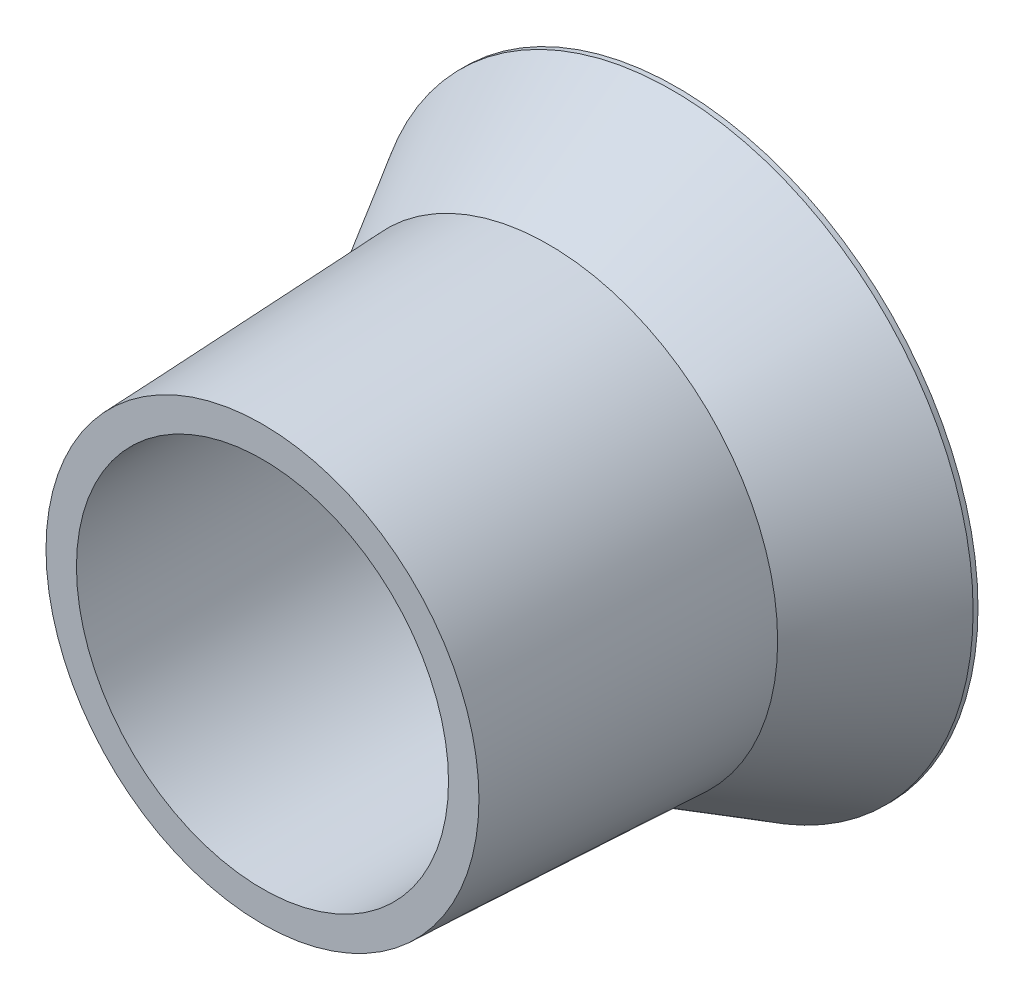
ISO-10303-21;
HEADER;
FILE_DESCRIPTION(('STEP AP214'),'2;1');
FILE_NAME('part.step','',(''),(''),'','','');
FILE_SCHEMA(('AUTOMOTIVE_DESIGN { 1 0 10303 214 1 1 1 1 }'));
ENDSEC;
DATA;
#1=APPLICATION_CONTEXT('core data for automotive mechanical design processes');
#2=APPLICATION_PROTOCOL_DEFINITION('international standard','automotive_design',2000,#1);
#3=PRODUCT_CONTEXT('',#1,'mechanical');
#4=PRODUCT('Part','Part','',(#3));
#5=PRODUCT_RELATED_PRODUCT_CATEGORY('part','',(#4));
#6=PRODUCT_DEFINITION_FORMATION('','',#4);
#7=PRODUCT_DEFINITION_CONTEXT('part definition',#1,'design');
#8=PRODUCT_DEFINITION('design','',#6,#7);
#9=PRODUCT_DEFINITION_SHAPE('','',#8);
#10=(LENGTH_UNIT() NAMED_UNIT(*) SI_UNIT(.MILLI.,.METRE.));
#11=(NAMED_UNIT(*) PLANE_ANGLE_UNIT() SI_UNIT($,.RADIAN.));
#12=(NAMED_UNIT(*) SI_UNIT($,.STERADIAN.) SOLID_ANGLE_UNIT());
#13=UNCERTAINTY_MEASURE_WITH_UNIT(LENGTH_MEASURE(1.E-05),#10,'distance_accuracy_value','');
#14=(GEOMETRIC_REPRESENTATION_CONTEXT(3) GLOBAL_UNCERTAINTY_ASSIGNED_CONTEXT((#13)) GLOBAL_UNIT_ASSIGNED_CONTEXT((#10,
#11,#12)) REPRESENTATION_CONTEXT('',''));
#15=CARTESIAN_POINT('',(0.,0.,0.));
#16=DIRECTION('',(0.,0.,1.));
#17=DIRECTION('',(1.,0.,0.));
#18=AXIS2_PLACEMENT_3D('',#15,#16,#17);
#19=CARTESIAN_POINT('',(0.,0.,50.));
#20=DIRECTION('',(0.,0.,1.));
#21=DIRECTION('',(1.,0.,0.));
#22=AXIS2_PLACEMENT_3D('',#19,#20,#21);
#23=PLANE('',#22);
#24=CARTESIAN_POINT('',(0.,0.,50.));
#25=DIRECTION('',(0.,0.,1.));
#26=DIRECTION('',(1.,0.,0.));
#27=AXIS2_PLACEMENT_3D('',#24,#25,#26);
#28=CIRCLE('',#27,37.8169528545742);
#29=CARTESIAN_POINT('',(37.8169528545742,0.,50.));
#30=VERTEX_POINT('',#29);
#31=EDGE_CURVE('E38',#30,#30,#28,.T.);
#32=ORIENTED_EDGE('',*,*,#31,.T.);
#33=EDGE_LOOP('',(#32));
#34=FACE_BOUND('',#33,.T.);
#35=CARTESIAN_POINT('',(0.,0.,50.));
#36=DIRECTION('',(0.,0.,1.));
#37=DIRECTION('',(1.,0.,0.));
#38=AXIS2_PLACEMENT_3D('',#35,#36,#37);
#39=CIRCLE('',#38,32.5);
#40=CARTESIAN_POINT('',(32.5,0.,50.));
#41=VERTEX_POINT('',#40);
#42=EDGE_CURVE('E42',#41,#41,#39,.T.);
#43=ORIENTED_EDGE('',*,*,#42,.F.);
#44=EDGE_LOOP('',(#43));
#45=FACE_BOUND('',#44,.T.);
#46=ADVANCED_FACE('F31',(#34,#45),#23,.T.);
#47=CARTESIAN_POINT('',(0.,0.,50.));
#48=DIRECTION('',(0.,0.,-1.));
#49=DIRECTION('',(-1.,0.,0.));
#50=AXIS2_PLACEMENT_3D('',#47,#48,#49);
#51=CYLINDRICAL_SURFACE('',#50,32.5);
#52=ORIENTED_EDGE('',*,*,#42,.T.);
#53=EDGE_LOOP('',(#52));
#54=FACE_BOUND('',#53,.T.);
#55=CARTESIAN_POINT('',(0.,0.,-22.5));
#56=DIRECTION('',(0.,0.,-1.));
#57=DIRECTION('',(-1.,0.,0.));
#58=AXIS2_PLACEMENT_3D('',#55,#56,#57);
#59=CIRCLE('',#58,32.5);
#60=CARTESIAN_POINT('',(-32.5,0.,-22.5));
#61=VERTEX_POINT('',#60);
#62=EDGE_CURVE('E54',#61,#61,#59,.T.);
#63=ORIENTED_EDGE('',*,*,#62,.T.);
#64=EDGE_LOOP('',(#63));
#65=FACE_BOUND('',#64,.T.);
#66=ADVANCED_FACE('F58',(#54,#65),#51,.F.);
#67=CARTESIAN_POINT('',(0.,0.,50.));
#68=DIRECTION('',(0.,0.,-1.));
#69=DIRECTION('',(-1.,0.,0.));
#70=AXIS2_PLACEMENT_3D('',#67,#68,#69);
#71=CONICAL_SURFACE('',#70,37.8169528545742,0.0436332312998548);
#72=CARTESIAN_POINT('',(0.,0.,0.));
#73=DIRECTION('',(0.,0.,-1.));
#74=DIRECTION('',(-1.,0.,0.));
#75=AXIS2_PLACEMENT_3D('',#72,#73,#74);
#76=CIRCLE('',#75,39.9999999999997);
#77=CARTESIAN_POINT('',(-39.9999999999997,0.,0.));
#78=VERTEX_POINT('',#77);
#79=EDGE_CURVE('E46',#78,#78,#76,.F.);
#80=ORIENTED_EDGE('',*,*,#79,.T.);
#81=EDGE_LOOP('',(#80));
#82=FACE_BOUND('',#81,.T.);
#83=ORIENTED_EDGE('',*,*,#31,.F.);
#84=EDGE_LOOP('',(#83));
#85=FACE_BOUND('',#84,.T.);
#86=ADVANCED_FACE('F63',(#82,#85),#71,.T.);
#87=CARTESIAN_POINT('',(0.,0.,-22.5));
#88=DIRECTION('',(0.,0.,-1.));
#89=DIRECTION('',(-1.,0.,0.));
#90=AXIS2_PLACEMENT_3D('',#87,#88,#89);
#91=PLANE('',#90);
#92=CARTESIAN_POINT('',(0.,0.,-22.5));
#93=DIRECTION('',(0.,0.,-1.));
#94=DIRECTION('',(-1.,0.,0.));
#95=AXIS2_PLACEMENT_3D('',#92,#93,#94);
#96=CIRCLE('',#95,52.5);
#97=CARTESIAN_POINT('',(52.5,0.,-22.5));
#98=VERTEX_POINT('',#97);
#99=EDGE_CURVE('E51',#98,#98,#96,.T.);
#100=ORIENTED_EDGE('',*,*,#99,.T.);
#101=EDGE_LOOP('',(#100));
#102=FACE_BOUND('',#101,.T.);
#103=ORIENTED_EDGE('',*,*,#62,.F.);
#104=EDGE_LOOP('',(#103));
#105=FACE_BOUND('',#104,.T.);
#106=ADVANCED_FACE('F60',(#102,#105),#91,.T.);
#107=CARTESIAN_POINT('',(0.,0.,-22.5));
#108=DIRECTION('',(0.,0.,1.));
#109=DIRECTION('',(1.,0.,0.));
#110=AXIS2_PLACEMENT_3D('',#107,#108,#109);
#111=CYLINDRICAL_SURFACE('',#110,52.5);
#112=CARTESIAN_POINT('',(0.,0.,-21.6506350946112));
#113=DIRECTION('',(0.,0.,-1.));
#114=DIRECTION('',(-1.,0.,0.));
#115=AXIS2_PLACEMENT_3D('',#112,#113,#114);
#116=CIRCLE('',#115,52.5);
#117=CARTESIAN_POINT('',(52.5,0.,-21.6506350946112));
#118=VERTEX_POINT('',#117);
#119=EDGE_CURVE('E10',#118,#118,#116,.T.);
#120=CARTESIAN_POINT('',(52.5,0.,-21.6506350946112));
#121=CARTESIAN_POINT('',(52.5,0.,-21.659482645709));
#122=CARTESIAN_POINT('',(52.5,0.,-21.6683301968068));
#123=CARTESIAN_POINT('',(52.5,0.,-21.6860252990024));
#124=CARTESIAN_POINT('',(52.5,0.,-21.6948728501002));
#125=CARTESIAN_POINT('',(52.5,0.,-21.7125679522958));
#126=CARTESIAN_POINT('',(52.5,0.,-21.7214155033936));
#127=CARTESIAN_POINT('',(52.5,0.,-21.7391106055892));
#128=CARTESIAN_POINT('',(52.5,0.,-21.747958156687));
#129=CARTESIAN_POINT('',(52.5,0.,-21.7656532588826));
#130=CARTESIAN_POINT('',(52.5,0.,-21.7745008099804));
#131=CARTESIAN_POINT('',(52.5,0.,-21.792195912176));
#132=CARTESIAN_POINT('',(52.5,0.,-21.8010434632738));
#133=CARTESIAN_POINT('',(52.5,0.,-21.8187385654694));
#134=CARTESIAN_POINT('',(52.5,0.,-21.8275861165672));
#135=CARTESIAN_POINT('',(52.5,0.,-21.8452812187628));
#136=CARTESIAN_POINT('',(52.5,0.,-21.8541287698606));
#137=CARTESIAN_POINT('',(52.5,0.,-21.8718238720562));
#138=CARTESIAN_POINT('',(52.5,0.,-21.880671423154));
#139=CARTESIAN_POINT('',(52.5,0.,-21.8983665253496));
#140=CARTESIAN_POINT('',(52.5,0.,-21.9072140764474));
#141=CARTESIAN_POINT('',(52.5,0.,-21.924909178643));
#142=CARTESIAN_POINT('',(52.5,0.,-21.9337567297408));
#143=CARTESIAN_POINT('',(52.5,0.,-21.9514518319364));
#144=CARTESIAN_POINT('',(52.5,0.,-21.9602993830342));
#145=CARTESIAN_POINT('',(52.5,0.,-21.9779944852298));
#146=CARTESIAN_POINT('',(52.5,0.,-21.9868420363276));
#147=CARTESIAN_POINT('',(52.5,0.,-22.0045371385232));
#148=CARTESIAN_POINT('',(52.5,0.,-22.013384689621));
#149=CARTESIAN_POINT('',(52.5,0.,-22.0310797918166));
#150=CARTESIAN_POINT('',(52.5,0.,-22.0399273429144));
#151=CARTESIAN_POINT('',(52.5,0.,-22.05762244511));
#152=CARTESIAN_POINT('',(52.5,0.,-22.0664699962078));
#153=CARTESIAN_POINT('',(52.5,0.,-22.0841650984034));
#154=CARTESIAN_POINT('',(52.5,0.,-22.0930126495012));
#155=CARTESIAN_POINT('',(52.5,0.,-22.1107077516968));
#156=CARTESIAN_POINT('',(52.5,0.,-22.1195553027946));
#157=CARTESIAN_POINT('',(52.5,0.,-22.1372504049902));
#158=CARTESIAN_POINT('',(52.5,0.,-22.146097956088));
#159=CARTESIAN_POINT('',(52.5,0.,-22.1637930582836));
#160=CARTESIAN_POINT('',(52.5,0.,-22.1726406093814));
#161=CARTESIAN_POINT('',(52.5,0.,-22.190335711577));
#162=CARTESIAN_POINT('',(52.5,0.,-22.1991832626748));
#163=CARTESIAN_POINT('',(52.5,0.,-22.2168783648704));
#164=CARTESIAN_POINT('',(52.5,0.,-22.2257259159682));
#165=CARTESIAN_POINT('',(52.5,0.,-22.2434210181638));
#166=CARTESIAN_POINT('',(52.5,0.,-22.2522685692616));
#167=CARTESIAN_POINT('',(52.5,0.,-22.2699636714572));
#168=CARTESIAN_POINT('',(52.5,0.,-22.278811222555));
#169=CARTESIAN_POINT('',(52.5,0.,-22.2965063247506));
#170=CARTESIAN_POINT('',(52.5,0.,-22.3053538758484));
#171=CARTESIAN_POINT('',(52.5,0.,-22.323048978044));
#172=CARTESIAN_POINT('',(52.5,0.,-22.3318965291418));
#173=CARTESIAN_POINT('',(52.5,0.,-22.3495916313374));
#174=CARTESIAN_POINT('',(52.5,0.,-22.3584391824352));
#175=CARTESIAN_POINT('',(52.5,0.,-22.3761342846308));
#176=CARTESIAN_POINT('',(52.5,0.,-22.3849818357286));
#177=CARTESIAN_POINT('',(52.5,0.,-22.4026769379242));
#178=CARTESIAN_POINT('',(52.5,0.,-22.411524489022));
#179=CARTESIAN_POINT('',(52.5,0.,-22.4292195912176));
#180=CARTESIAN_POINT('',(52.5,0.,-22.4380671423154));
#181=CARTESIAN_POINT('',(52.5,0.,-22.455762244511));
#182=CARTESIAN_POINT('',(52.5,0.,-22.4646097956088));
#183=CARTESIAN_POINT('',(52.5,0.,-22.4823048978044));
#184=CARTESIAN_POINT('',(52.5,0.,-22.4911524489022));
#185=CARTESIAN_POINT('',(52.5,0.,-22.5));
#186=B_SPLINE_CURVE_WITH_KNOTS('',3,(#120,#121,#122,#123,#124,#125,#126,#127,#128,#129,#130,
#131,#132,#133,#134,#135,#136,#137,#138,#139,#140,#141,#142,#143,#144,#145,#146,#147,#148,#149,
#150,#151,#152,#153,#154,#155,#156,#157,#158,#159,#160,#161,#162,#163,#164,#165,#166,#167,#168,
#169,#170,#171,#172,#173,#174,#175,#176,#177,#178,#179,#180,#181,#182,#183,#184,#185),
.UNSPECIFIED.,.F.,.F.,(4,2,2,2,2,2,2,2,2,2,2,2,2,2,2,2,2,2,2,2,2,2,2,2,2,2,2,2,2,2,2,2,4),(0.,
0.0265426532933995,0.0530853065867989,0.0796279598801984,0.106170613173598,0.132713266466997,
0.159255919760397,0.185798573053796,0.212341226347196,0.238883879640595,0.265426532933995,
0.291969186227394,0.318511839520794,0.345054492814193,0.371597146107593,0.398139799400992,
0.424682452694388,0.451225105987788,0.477767759281187,0.504310412574587,0.530853065867986,
0.557395719161385,0.583938372454785,0.610481025748184,0.637023679041584,0.663566332334983,
0.690108985628383,0.716651638921782,0.743194292215182,0.769736945508581,0.796279598801981,
0.82282225209538,0.84936490538878),.UNSPECIFIED.);
#187=EDGE_CURVE('BSEAM62',#118,#98,#186,.T.);
#188=ORIENTED_EDGE('',*,*,#119,.T.);
#189=ORIENTED_EDGE('',*,*,#99,.F.);
#190=ORIENTED_EDGE('',*,*,#187,.T.);
#191=ORIENTED_EDGE('',*,*,#187,.F.);
#192=EDGE_LOOP('',(#188,#190,#189,#191));
#193=FACE_BOUND('',#192,.T.);
#194=ADVANCED_FACE('F62',(#193),#111,.T.);
#195=CARTESIAN_POINT('',(0.,0.,-21.6506350946112));
#196=DIRECTION('',(0.,0.,-1.));
#197=DIRECTION('',(-1.,0.,0.));
#198=AXIS2_PLACEMENT_3D('',#195,#196,#197);
#199=CONICAL_SURFACE('',#198,52.5,0.5235987755983);
#200=ORIENTED_EDGE('',*,*,#79,.F.);
#201=EDGE_LOOP('',(#200));
#202=FACE_BOUND('',#201,.T.);
#203=ORIENTED_EDGE('',*,*,#119,.F.);
#204=EDGE_LOOP('',(#203));
#205=FACE_BOUND('',#204,.T.);
#206=ADVANCED_FACE('F33',(#202,#205),#199,.T.);
#207=CLOSED_SHELL('',(#46,#66,#86,#106,#194,#206));
#208=MANIFOLD_SOLID_BREP('B2',#207);
#209=ADVANCED_BREP_SHAPE_REPRESENTATION('',(#18,#208),#14);
#210=SHAPE_DEFINITION_REPRESENTATION(#9,#209);
ENDSEC;
END-ISO-10303-21;
